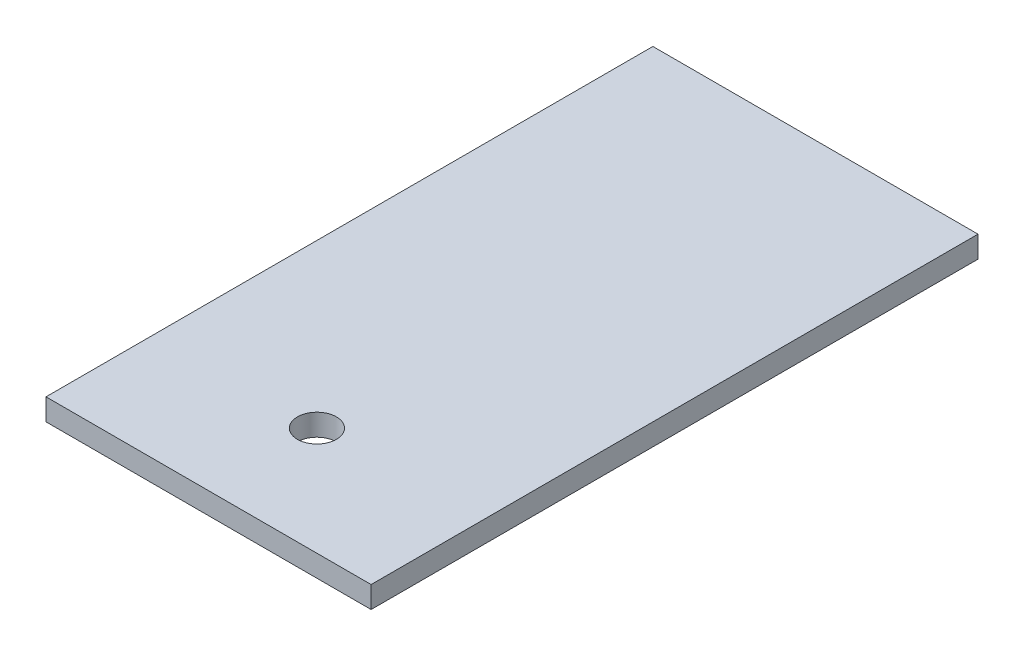
ISO-10303-21;
HEADER;
FILE_DESCRIPTION(('STEP AP214'),'2;1');
FILE_NAME('part.step','',(''),(''),'','','');
FILE_SCHEMA(('AUTOMOTIVE_DESIGN { 1 0 10303 214 1 1 1 1 }'));
ENDSEC;
DATA;
#1=APPLICATION_CONTEXT('core data for automotive mechanical design processes');
#2=APPLICATION_PROTOCOL_DEFINITION('international standard','automotive_design',2000,#1);
#3=PRODUCT_CONTEXT('',#1,'mechanical');
#4=PRODUCT('Part','Part','',(#3));
#5=PRODUCT_RELATED_PRODUCT_CATEGORY('part','',(#4));
#6=PRODUCT_DEFINITION_FORMATION('','',#4);
#7=PRODUCT_DEFINITION_CONTEXT('part definition',#1,'design');
#8=PRODUCT_DEFINITION('design','',#6,#7);
#9=PRODUCT_DEFINITION_SHAPE('','',#8);
#10=(LENGTH_UNIT() NAMED_UNIT(*) SI_UNIT(.MILLI.,.METRE.));
#11=(NAMED_UNIT(*) PLANE_ANGLE_UNIT() SI_UNIT($,.RADIAN.));
#12=(NAMED_UNIT(*) SI_UNIT($,.STERADIAN.) SOLID_ANGLE_UNIT());
#13=UNCERTAINTY_MEASURE_WITH_UNIT(LENGTH_MEASURE(1.E-05),#10,'distance_accuracy_value','');
#14=(GEOMETRIC_REPRESENTATION_CONTEXT(3) GLOBAL_UNCERTAINTY_ASSIGNED_CONTEXT((#13)) GLOBAL_UNIT_ASSIGNED_CONTEXT((#10,
#11,#12)) REPRESENTATION_CONTEXT('',''));
#15=CARTESIAN_POINT('',(0.,0.,0.));
#16=DIRECTION('',(0.,0.,1.));
#17=DIRECTION('',(1.,0.,0.));
#18=AXIS2_PLACEMENT_3D('',#15,#16,#17);
#19=CARTESIAN_POINT('',(0.,10.,0.));
#20=DIRECTION('',(0.,-1.,0.));
#21=DIRECTION('',(0.,0.,-1.));
#22=AXIS2_PLACEMENT_3D('',#19,#20,#21);
#23=PLANE('',#22);
#24=DIRECTION('',(0.,0.,1.));
#25=VECTOR('',#24,1.);
#26=CARTESIAN_POINT('',(-75.,10.,140.));
#27=LINE('',#26,#25);
#28=CARTESIAN_POINT('',(-75.,10.,-140.));
#29=VERTEX_POINT('',#28);
#30=CARTESIAN_POINT('',(-75.,10.,140.));
#31=VERTEX_POINT('',#30);
#32=EDGE_CURVE('E84',#29,#31,#27,.T.);
#33=ORIENTED_EDGE('',*,*,#32,.T.);
#34=DIRECTION('',(1.,0.,0.));
#35=VECTOR('',#34,1.);
#36=CARTESIAN_POINT('',(-75.,10.,140.));
#37=LINE('',#36,#35);
#38=CARTESIAN_POINT('',(75.,10.,140.));
#39=VERTEX_POINT('',#38);
#40=EDGE_CURVE('E79',#31,#39,#37,.T.);
#41=ORIENTED_EDGE('',*,*,#40,.T.);
#42=DIRECTION('',(0.,0.,-1.));
#43=VECTOR('',#42,1.);
#44=CARTESIAN_POINT('',(75.,10.,140.));
#45=LINE('',#44,#43);
#46=CARTESIAN_POINT('',(75.,10.,-140.));
#47=VERTEX_POINT('',#46);
#48=EDGE_CURVE('E82',#39,#47,#45,.T.);
#49=ORIENTED_EDGE('',*,*,#48,.T.);
#50=DIRECTION('',(-1.,0.,0.));
#51=VECTOR('',#50,1.);
#52=CARTESIAN_POINT('',(-75.,10.,-140.));
#53=LINE('',#52,#51);
#54=EDGE_CURVE('E49',#47,#29,#53,.T.);
#55=ORIENTED_EDGE('',*,*,#54,.T.);
#56=EDGE_LOOP('',(#33,#41,#49,#55));
#57=FACE_BOUND('',#56,.T.);
#58=CARTESIAN_POINT('',(0.,10.,90.0000000000001));
#59=DIRECTION('',(0.,1.,0.));
#60=DIRECTION('',(0.,0.,1.));
#61=AXIS2_PLACEMENT_3D('',#58,#59,#60);
#62=CIRCLE('',#61,9.);
#63=CARTESIAN_POINT('',(0.,10.,99.));
#64=VERTEX_POINT('',#63);
#65=EDGE_CURVE('E99',#64,#64,#62,.T.);
#66=ORIENTED_EDGE('',*,*,#65,.F.);
#67=EDGE_LOOP('',(#66));
#68=FACE_BOUND('',#67,.T.);
#69=ADVANCED_FACE('F32',(#57,#68),#23,.F.);
#70=CARTESIAN_POINT('',(0.,0.,0.));
#71=DIRECTION('',(0.,-1.,0.));
#72=DIRECTION('',(0.,0.,-1.));
#73=AXIS2_PLACEMENT_3D('',#70,#71,#72);
#74=PLANE('',#73);
#75=DIRECTION('',(0.,0.,1.));
#76=VECTOR('',#75,1.);
#77=CARTESIAN_POINT('',(-75.,0.,140.));
#78=LINE('',#77,#76);
#79=CARTESIAN_POINT('',(-75.,0.,-140.));
#80=VERTEX_POINT('',#79);
#81=CARTESIAN_POINT('',(-75.,0.,140.));
#82=VERTEX_POINT('',#81);
#83=EDGE_CURVE('E96',#80,#82,#78,.T.);
#84=ORIENTED_EDGE('',*,*,#83,.F.);
#85=DIRECTION('',(-1.,0.,0.));
#86=VECTOR('',#85,1.);
#87=CARTESIAN_POINT('',(-75.,0.,-140.));
#88=LINE('',#87,#86);
#89=CARTESIAN_POINT('',(75.,0.,-140.));
#90=VERTEX_POINT('',#89);
#91=EDGE_CURVE('E72',#90,#80,#88,.T.);
#92=ORIENTED_EDGE('',*,*,#91,.F.);
#93=DIRECTION('',(0.,0.,-1.));
#94=VECTOR('',#93,1.);
#95=CARTESIAN_POINT('',(75.,0.,140.));
#96=LINE('',#95,#94);
#97=CARTESIAN_POINT('',(75.,0.,140.));
#98=VERTEX_POINT('',#97);
#99=EDGE_CURVE('E66',#98,#90,#96,.T.);
#100=ORIENTED_EDGE('',*,*,#99,.F.);
#101=DIRECTION('',(1.,0.,0.));
#102=VECTOR('',#101,1.);
#103=CARTESIAN_POINT('',(-75.,0.,140.));
#104=LINE('',#103,#102);
#105=EDGE_CURVE('E88',#82,#98,#104,.T.);
#106=ORIENTED_EDGE('',*,*,#105,.F.);
#107=EDGE_LOOP('',(#84,#92,#100,#106));
#108=FACE_BOUND('',#107,.T.);
#109=CARTESIAN_POINT('',(0.,0.,90.0000000000001));
#110=DIRECTION('',(0.,1.,0.));
#111=DIRECTION('',(0.,0.,1.));
#112=AXIS2_PLACEMENT_3D('',#109,#110,#111);
#113=CIRCLE('',#112,9.);
#114=CARTESIAN_POINT('',(0.,0.,99.));
#115=VERTEX_POINT('',#114);
#116=EDGE_CURVE('E111',#115,#115,#113,.T.);
#117=ORIENTED_EDGE('',*,*,#116,.T.);
#118=EDGE_LOOP('',(#117));
#119=FACE_BOUND('',#118,.T.);
#120=ADVANCED_FACE('F107',(#108,#119),#74,.T.);
#121=CARTESIAN_POINT('',(-75.,10.,140.));
#122=DIRECTION('',(1.,0.,0.));
#123=DIRECTION('',(0.,0.,-1.));
#124=AXIS2_PLACEMENT_3D('',#121,#122,#123);
#125=PLANE('',#124);
#126=ORIENTED_EDGE('',*,*,#83,.T.);
#127=DIRECTION('',(0.,-1.,0.));
#128=VECTOR('',#127,1.);
#129=CARTESIAN_POINT('',(-75.,10.,140.));
#130=LINE('',#129,#128);
#131=EDGE_CURVE('E11',#31,#82,#130,.T.);
#132=ORIENTED_EDGE('',*,*,#131,.F.);
#133=ORIENTED_EDGE('',*,*,#32,.F.);
#134=DIRECTION('',(0.,-1.,0.));
#135=VECTOR('',#134,1.);
#136=CARTESIAN_POINT('',(-75.,10.,-140.));
#137=LINE('',#136,#135);
#138=EDGE_CURVE('E92',#29,#80,#137,.T.);
#139=ORIENTED_EDGE('',*,*,#138,.T.);
#140=EDGE_LOOP('',(#126,#132,#133,#139));
#141=FACE_BOUND('',#140,.T.);
#142=ADVANCED_FACE('F34',(#141),#125,.F.);
#143=CARTESIAN_POINT('',(-75.,10.,140.));
#144=DIRECTION('',(0.,0.,-1.));
#145=DIRECTION('',(-1.,0.,0.));
#146=AXIS2_PLACEMENT_3D('',#143,#144,#145);
#147=PLANE('',#146);
#148=ORIENTED_EDGE('',*,*,#105,.T.);
#149=DIRECTION('',(0.,-1.,0.));
#150=VECTOR('',#149,1.);
#151=CARTESIAN_POINT('',(75.,10.,140.));
#152=LINE('',#151,#150);
#153=EDGE_CURVE('E41',#39,#98,#152,.T.);
#154=ORIENTED_EDGE('',*,*,#153,.F.);
#155=ORIENTED_EDGE('',*,*,#40,.F.);
#156=ORIENTED_EDGE('',*,*,#131,.T.);
#157=EDGE_LOOP('',(#148,#154,#155,#156));
#158=FACE_BOUND('',#157,.T.);
#159=ADVANCED_FACE('F87',(#158),#147,.F.);
#160=CARTESIAN_POINT('',(75.,10.,140.));
#161=DIRECTION('',(-1.,0.,0.));
#162=DIRECTION('',(0.,0.,1.));
#163=AXIS2_PLACEMENT_3D('',#160,#161,#162);
#164=PLANE('',#163);
#165=ORIENTED_EDGE('',*,*,#99,.T.);
#166=DIRECTION('',(0.,-1.,0.));
#167=VECTOR('',#166,1.);
#168=CARTESIAN_POINT('',(75.,10.,-140.));
#169=LINE('',#168,#167);
#170=EDGE_CURVE('E89',#47,#90,#169,.T.);
#171=ORIENTED_EDGE('',*,*,#170,.F.);
#172=ORIENTED_EDGE('',*,*,#48,.F.);
#173=ORIENTED_EDGE('',*,*,#153,.T.);
#174=EDGE_LOOP('',(#165,#171,#172,#173));
#175=FACE_BOUND('',#174,.T.);
#176=ADVANCED_FACE('F90',(#175),#164,.F.);
#177=CARTESIAN_POINT('',(-75.,10.,-140.));
#178=DIRECTION('',(0.,0.,1.));
#179=DIRECTION('',(1.,0.,0.));
#180=AXIS2_PLACEMENT_3D('',#177,#178,#179);
#181=PLANE('',#180);
#182=ORIENTED_EDGE('',*,*,#91,.T.);
#183=ORIENTED_EDGE('',*,*,#138,.F.);
#184=ORIENTED_EDGE('',*,*,#54,.F.);
#185=ORIENTED_EDGE('',*,*,#170,.T.);
#186=EDGE_LOOP('',(#182,#183,#184,#185));
#187=FACE_BOUND('',#186,.T.);
#188=ADVANCED_FACE('F104',(#187),#181,.F.);
#189=CARTESIAN_POINT('',(0.,10.,90.0000000000001));
#190=DIRECTION('',(0.,-1.,0.));
#191=DIRECTION('',(0.,0.,-1.));
#192=AXIS2_PLACEMENT_3D('',#189,#190,#191);
#193=CYLINDRICAL_SURFACE('',#192,9.);
#194=ORIENTED_EDGE('',*,*,#65,.T.);
#195=EDGE_LOOP('',(#194));
#196=FACE_BOUND('',#195,.T.);
#197=ORIENTED_EDGE('',*,*,#116,.F.);
#198=EDGE_LOOP('',(#197));
#199=FACE_BOUND('',#198,.T.);
#200=ADVANCED_FACE('F117',(#196,#199),#193,.F.);
#201=CLOSED_SHELL('',(#69,#120,#142,#159,#176,#188,#200));
#202=MANIFOLD_SOLID_BREP('B2',#201);
#203=ADVANCED_BREP_SHAPE_REPRESENTATION('',(#18,#202),#14);
#204=SHAPE_DEFINITION_REPRESENTATION(#9,#203);
ENDSEC;
END-ISO-10303-21;
